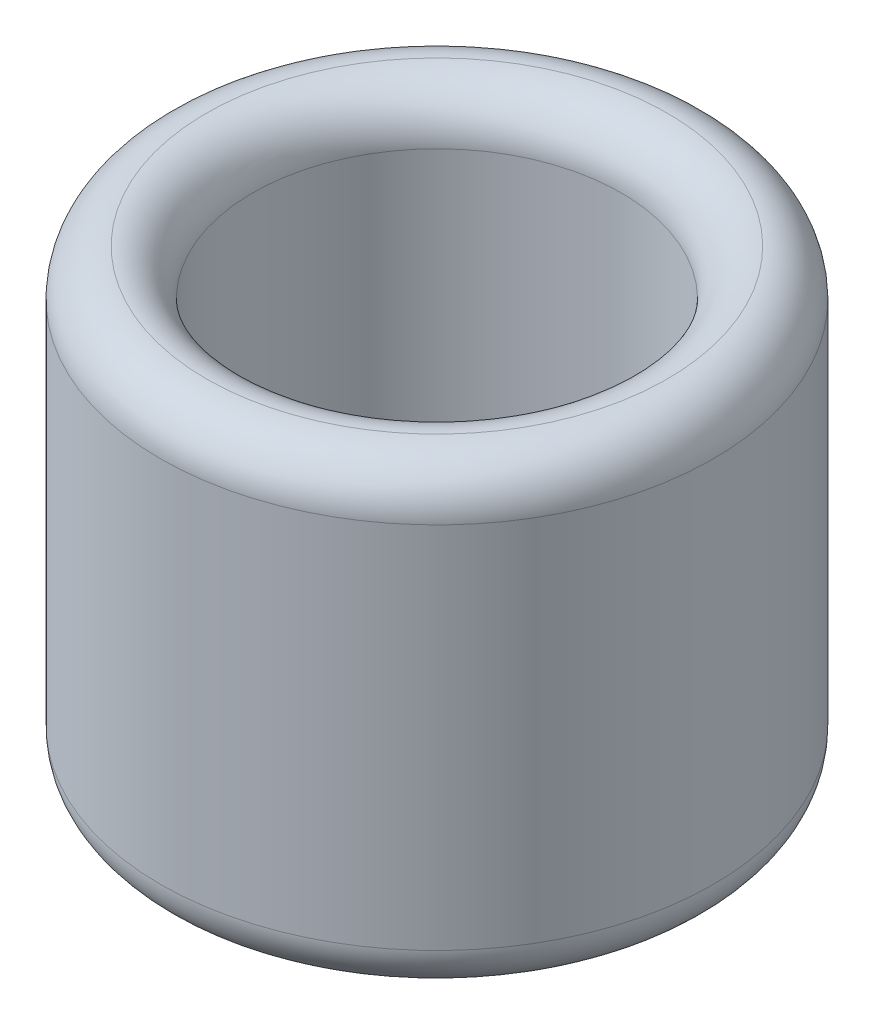
ISO-10303-21;
HEADER;
FILE_DESCRIPTION(('STEP AP214'),'2;1');
FILE_NAME('part.step','',(''),(''),'','','');
FILE_SCHEMA(('AUTOMOTIVE_DESIGN { 1 0 10303 214 1 1 1 1 }'));
ENDSEC;
DATA;
#1=APPLICATION_CONTEXT('core data for automotive mechanical design processes');
#2=APPLICATION_PROTOCOL_DEFINITION('international standard','automotive_design',2000,#1);
#3=PRODUCT_CONTEXT('',#1,'mechanical');
#4=PRODUCT('Part','Part','',(#3));
#5=PRODUCT_RELATED_PRODUCT_CATEGORY('part','',(#4));
#6=PRODUCT_DEFINITION_FORMATION('','',#4);
#7=PRODUCT_DEFINITION_CONTEXT('part definition',#1,'design');
#8=PRODUCT_DEFINITION('design','',#6,#7);
#9=PRODUCT_DEFINITION_SHAPE('','',#8);
#10=(LENGTH_UNIT() NAMED_UNIT(*) SI_UNIT(.MILLI.,.METRE.));
#11=(NAMED_UNIT(*) PLANE_ANGLE_UNIT() SI_UNIT($,.RADIAN.));
#12=(NAMED_UNIT(*) SI_UNIT($,.STERADIAN.) SOLID_ANGLE_UNIT());
#13=UNCERTAINTY_MEASURE_WITH_UNIT(LENGTH_MEASURE(1.E-05),#10,'distance_accuracy_value','');
#14=(GEOMETRIC_REPRESENTATION_CONTEXT(3) GLOBAL_UNCERTAINTY_ASSIGNED_CONTEXT((#13)) GLOBAL_UNIT_ASSIGNED_CONTEXT((#10,
#11,#12)) REPRESENTATION_CONTEXT('',''));
#15=CARTESIAN_POINT('',(0.,0.,0.));
#16=DIRECTION('',(0.,0.,1.));
#17=DIRECTION('',(1.,0.,0.));
#18=AXIS2_PLACEMENT_3D('',#15,#16,#17);
#19=CARTESIAN_POINT('',(0.,10.,0.));
#20=DIRECTION('',(0.,-1.,0.));
#21=DIRECTION('',(0.,0.,-1.));
#22=AXIS2_PLACEMENT_3D('',#19,#20,#21);
#23=CYLINDRICAL_SURFACE('',#22,6.);
#24=CARTESIAN_POINT('',(0.,9.,0.));
#25=DIRECTION('',(0.,1.,0.));
#26=DIRECTION('',(0.,0.,1.));
#27=AXIS2_PLACEMENT_3D('',#24,#25,#26);
#28=CIRCLE('',#27,6.);
#29=CARTESIAN_POINT('',(0.,9.,6.));
#30=VERTEX_POINT('',#29);
#31=EDGE_CURVE('E10',#30,#30,#28,.F.);
#32=ORIENTED_EDGE('',*,*,#31,.T.);
#33=EDGE_LOOP('',(#32));
#34=FACE_BOUND('',#33,.T.);
#35=CARTESIAN_POINT('',(0.,0.999999999999999,0.));
#36=DIRECTION('',(0.,1.,0.));
#37=DIRECTION('',(0.,0.,1.));
#38=AXIS2_PLACEMENT_3D('',#35,#36,#37);
#39=CIRCLE('',#38,6.);
#40=CARTESIAN_POINT('',(0.,0.999999999999999,6.));
#41=VERTEX_POINT('',#40);
#42=EDGE_CURVE('E52',#41,#41,#39,.T.);
#43=ORIENTED_EDGE('',*,*,#42,.T.);
#44=EDGE_LOOP('',(#43));
#45=FACE_BOUND('',#44,.T.);
#46=ADVANCED_FACE('F43',(#34,#45),#23,.T.);
#47=CARTESIAN_POINT('',(0.,10.,0.));
#48=DIRECTION('',(0.,-1.,0.));
#49=DIRECTION('',(0.,0.,-1.));
#50=AXIS2_PLACEMENT_3D('',#47,#48,#49);
#51=CYLINDRICAL_SURFACE('',#50,4.);
#52=CARTESIAN_POINT('',(0.,9.,0.));
#53=DIRECTION('',(0.,1.,0.));
#54=DIRECTION('',(0.,0.,1.));
#55=AXIS2_PLACEMENT_3D('',#52,#53,#54);
#56=CIRCLE('',#55,4.);
#57=CARTESIAN_POINT('',(0.,9.,4.));
#58=VERTEX_POINT('',#57);
#59=EDGE_CURVE('E58',#58,#58,#56,.T.);
#60=ORIENTED_EDGE('',*,*,#59,.T.);
#61=EDGE_LOOP('',(#60));
#62=FACE_BOUND('',#61,.T.);
#63=CARTESIAN_POINT('',(0.,0.999999999999999,0.));
#64=DIRECTION('',(0.,1.,0.));
#65=DIRECTION('',(0.,0.,1.));
#66=AXIS2_PLACEMENT_3D('',#63,#64,#65);
#67=CIRCLE('',#66,4.);
#68=CARTESIAN_POINT('',(0.,0.999999999999999,4.));
#69=VERTEX_POINT('',#68);
#70=EDGE_CURVE('E64',#69,#69,#67,.F.);
#71=ORIENTED_EDGE('',*,*,#70,.T.);
#72=EDGE_LOOP('',(#71));
#73=FACE_BOUND('',#72,.T.);
#74=ADVANCED_FACE('F88',(#62,#73),#51,.F.);
#75=CARTESIAN_POINT('',(0.,9.,0.));
#76=DIRECTION('',(0.,1.,0.));
#77=DIRECTION('',(0.,0.,1.));
#78=AXIS2_PLACEMENT_3D('',#75,#76,#77);
#79=TOROIDAL_SURFACE('',#78,5.,1.);
#80=ORIENTED_EDGE('',*,*,#31,.F.);
#81=EDGE_LOOP('',(#80));
#82=FACE_BOUND('',#81,.T.);
#83=CARTESIAN_POINT('',(0.,10.,0.));
#84=DIRECTION('',(0.,1.,0.));
#85=DIRECTION('',(0.,0.,1.));
#86=AXIS2_PLACEMENT_3D('',#83,#84,#85);
#87=CIRCLE('',#86,5.);
#88=CARTESIAN_POINT('',(0.,10.,5.));
#89=VERTEX_POINT('',#88);
#90=EDGE_CURVE('E61',#89,#89,#87,.T.);
#91=ORIENTED_EDGE('',*,*,#90,.F.);
#92=EDGE_LOOP('',(#91));
#93=FACE_BOUND('',#92,.T.);
#94=ADVANCED_FACE('F84',(#82,#93),#79,.T.);
#95=CARTESIAN_POINT('',(0.,9.,0.));
#96=DIRECTION('',(0.,1.,0.));
#97=DIRECTION('',(0.,0.,1.));
#98=AXIS2_PLACEMENT_3D('',#95,#96,#97);
#99=TOROIDAL_SURFACE('',#98,5.,1.);
#100=ORIENTED_EDGE('',*,*,#90,.T.);
#101=EDGE_LOOP('',(#100));
#102=FACE_BOUND('',#101,.T.);
#103=ORIENTED_EDGE('',*,*,#59,.F.);
#104=EDGE_LOOP('',(#103));
#105=FACE_BOUND('',#104,.T.);
#106=ADVANCED_FACE('F77',(#102,#105),#99,.T.);
#107=CARTESIAN_POINT('',(0.,0.999999999999999,0.));
#108=DIRECTION('',(0.,1.,0.));
#109=DIRECTION('',(0.,0.,1.));
#110=AXIS2_PLACEMENT_3D('',#107,#108,#109);
#111=TOROIDAL_SURFACE('',#110,5.,1.);
#112=ORIENTED_EDGE('',*,*,#42,.F.);
#113=EDGE_LOOP('',(#112));
#114=FACE_BOUND('',#113,.T.);
#115=CARTESIAN_POINT('',(0.,0.,0.));
#116=DIRECTION('',(0.,1.,0.));
#117=DIRECTION('',(0.,0.,1.));
#118=AXIS2_PLACEMENT_3D('',#115,#116,#117);
#119=CIRCLE('',#118,5.);
#120=CARTESIAN_POINT('',(0.,0.,5.));
#121=VERTEX_POINT('',#120);
#122=EDGE_CURVE('E47',#121,#121,#119,.F.);
#123=ORIENTED_EDGE('',*,*,#122,.F.);
#124=EDGE_LOOP('',(#123));
#125=FACE_BOUND('',#124,.T.);
#126=ADVANCED_FACE('F45',(#114,#125),#111,.T.);
#127=CARTESIAN_POINT('',(0.,0.999999999999999,0.));
#128=DIRECTION('',(0.,1.,0.));
#129=DIRECTION('',(0.,0.,1.));
#130=AXIS2_PLACEMENT_3D('',#127,#128,#129);
#131=TOROIDAL_SURFACE('',#130,5.,1.);
#132=ORIENTED_EDGE('',*,*,#70,.F.);
#133=EDGE_LOOP('',(#132));
#134=FACE_BOUND('',#133,.T.);
#135=ORIENTED_EDGE('',*,*,#122,.T.);
#136=EDGE_LOOP('',(#135));
#137=FACE_BOUND('',#136,.T.);
#138=ADVANCED_FACE('F74',(#134,#137),#131,.T.);
#139=CLOSED_SHELL('',(#46,#74,#94,#106,#126,#138));
#140=MANIFOLD_SOLID_BREP('B2',#139);
#141=ADVANCED_BREP_SHAPE_REPRESENTATION('',(#18,#140),#14);
#142=SHAPE_DEFINITION_REPRESENTATION(#9,#141);
ENDSEC;
END-ISO-10303-21;
